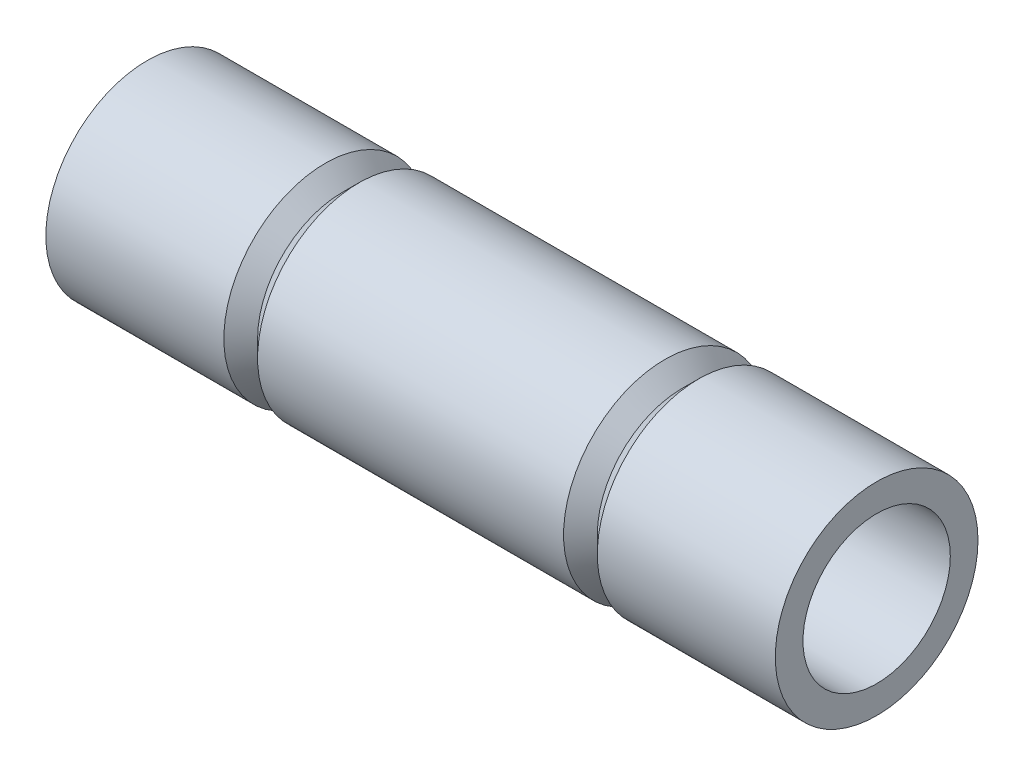
ISO-10303-21;
HEADER;
FILE_DESCRIPTION(('STEP AP214'),'2;1');
FILE_NAME('part.step','',(''),(''),'','','');
FILE_SCHEMA(('AUTOMOTIVE_DESIGN { 1 0 10303 214 1 1 1 1 }'));
ENDSEC;
DATA;
#1=APPLICATION_CONTEXT('core data for automotive mechanical design processes');
#2=APPLICATION_PROTOCOL_DEFINITION('international standard','automotive_design',2000,#1);
#3=PRODUCT_CONTEXT('',#1,'mechanical');
#4=PRODUCT('Part','Part','',(#3));
#5=PRODUCT_RELATED_PRODUCT_CATEGORY('part','',(#4));
#6=PRODUCT_DEFINITION_FORMATION('','',#4);
#7=PRODUCT_DEFINITION_CONTEXT('part definition',#1,'design');
#8=PRODUCT_DEFINITION('design','',#6,#7);
#9=PRODUCT_DEFINITION_SHAPE('','',#8);
#10=(LENGTH_UNIT() NAMED_UNIT(*) SI_UNIT(.MILLI.,.METRE.));
#11=(NAMED_UNIT(*) PLANE_ANGLE_UNIT() SI_UNIT($,.RADIAN.));
#12=(NAMED_UNIT(*) SI_UNIT($,.STERADIAN.) SOLID_ANGLE_UNIT());
#13=UNCERTAINTY_MEASURE_WITH_UNIT(LENGTH_MEASURE(1.E-05),#10,'distance_accuracy_value','');
#14=(GEOMETRIC_REPRESENTATION_CONTEXT(3) GLOBAL_UNCERTAINTY_ASSIGNED_CONTEXT((#13)) GLOBAL_UNIT_ASSIGNED_CONTEXT((#10,
#11,#12)) REPRESENTATION_CONTEXT('',''));
#15=CARTESIAN_POINT('',(0.,0.,0.));
#16=DIRECTION('',(0.,0.,1.));
#17=DIRECTION('',(1.,0.,0.));
#18=AXIS2_PLACEMENT_3D('',#15,#16,#17);
#19=CARTESIAN_POINT('',(-75.692,0.,15.2908));
#20=DIRECTION('',(1.,0.,0.));
#21=DIRECTION('',(0.,0.,-1.));
#22=AXIS2_PLACEMENT_3D('',#19,#20,#21);
#23=PLANE('',#22);
#24=CARTESIAN_POINT('',(-75.692,0.,0.));
#25=DIRECTION('',(1.,0.,0.));
#26=DIRECTION('',(0.,0.,-1.));
#27=AXIS2_PLACEMENT_3D('',#24,#25,#26);
#28=CIRCLE('',#27,21.034375);
#29=CARTESIAN_POINT('',(-75.692,0.,-21.034375));
#30=VERTEX_POINT('',#29);
#31=EDGE_CURVE('E68',#30,#30,#28,.T.);
#32=ORIENTED_EDGE('',*,*,#31,.F.);
#33=EDGE_LOOP('',(#32));
#34=FACE_BOUND('',#33,.T.);
#35=CARTESIAN_POINT('',(-75.692,0.,0.));
#36=DIRECTION('',(1.,0.,0.));
#37=DIRECTION('',(0.,0.,-1.));
#38=AXIS2_PLACEMENT_3D('',#35,#36,#37);
#39=CIRCLE('',#38,15.2908);
#40=CARTESIAN_POINT('',(-75.692,0.,-15.2908));
#41=VERTEX_POINT('',#40);
#42=EDGE_CURVE('E10',#41,#41,#39,.T.);
#43=ORIENTED_EDGE('',*,*,#42,.T.);
#44=EDGE_LOOP('',(#43));
#45=FACE_BOUND('',#44,.T.);
#46=ADVANCED_FACE('F34',(#34,#45),#23,.F.);
#47=CARTESIAN_POINT('',(0.,0.,0.));
#48=DIRECTION('',(1.,0.,0.));
#49=DIRECTION('',(0.,0.,-1.));
#50=AXIS2_PLACEMENT_3D('',#47,#48,#49);
#51=CYLINDRICAL_SURFACE('',#50,15.2908);
#52=ORIENTED_EDGE('',*,*,#42,.F.);
#53=EDGE_LOOP('',(#52));
#54=FACE_BOUND('',#53,.T.);
#55=CARTESIAN_POINT('',(75.692,0.,0.));
#56=DIRECTION('',(1.,0.,0.));
#57=DIRECTION('',(0.,0.,-1.));
#58=AXIS2_PLACEMENT_3D('',#55,#56,#57);
#59=CIRCLE('',#58,15.2908);
#60=CARTESIAN_POINT('',(75.692,0.,-15.2908));
#61=VERTEX_POINT('',#60);
#62=EDGE_CURVE('E40',#61,#61,#59,.T.);
#63=ORIENTED_EDGE('',*,*,#62,.T.);
#64=EDGE_LOOP('',(#63));
#65=FACE_BOUND('',#64,.T.);
#66=ADVANCED_FACE('F75',(#54,#65),#51,.F.);
#67=CARTESIAN_POINT('',(75.692,0.,15.2908));
#68=DIRECTION('',(-1.,0.,0.));
#69=DIRECTION('',(0.,0.,1.));
#70=AXIS2_PLACEMENT_3D('',#67,#68,#69);
#71=PLANE('',#70);
#72=ORIENTED_EDGE('',*,*,#62,.F.);
#73=EDGE_LOOP('',(#72));
#74=FACE_BOUND('',#73,.T.);
#75=CARTESIAN_POINT('',(75.692,0.,0.));
#76=DIRECTION('',(1.,0.,0.));
#77=DIRECTION('',(0.,0.,-1.));
#78=AXIS2_PLACEMENT_3D('',#75,#76,#77);
#79=CIRCLE('',#78,21.034375);
#80=CARTESIAN_POINT('',(75.692,0.,-21.034375));
#81=VERTEX_POINT('',#80);
#82=EDGE_CURVE('E44',#81,#81,#79,.T.);
#83=ORIENTED_EDGE('',*,*,#82,.T.);
#84=EDGE_LOOP('',(#83));
#85=FACE_BOUND('',#84,.T.);
#86=ADVANCED_FACE('F79',(#74,#85),#71,.F.);
#87=CARTESIAN_POINT('',(0.,0.,0.));
#88=DIRECTION('',(1.,0.,0.));
#89=DIRECTION('',(0.,0.,-1.));
#90=AXIS2_PLACEMENT_3D('',#87,#88,#89);
#91=CYLINDRICAL_SURFACE('',#90,21.034375);
#92=ORIENTED_EDGE('',*,*,#82,.F.);
#93=EDGE_LOOP('',(#92));
#94=FACE_BOUND('',#93,.T.);
#95=CARTESIAN_POINT('',(38.75,0.,0.));
#96=DIRECTION('',(1.,0.,0.));
#97=DIRECTION('',(0.,0.,-1.));
#98=AXIS2_PLACEMENT_3D('',#95,#96,#97);
#99=CIRCLE('',#98,21.034375);
#100=CARTESIAN_POINT('',(38.75,0.,-21.034375));
#101=VERTEX_POINT('',#100);
#102=EDGE_CURVE('E48',#101,#101,#99,.T.);
#103=ORIENTED_EDGE('',*,*,#102,.T.);
#104=EDGE_LOOP('',(#103));
#105=FACE_BOUND('',#104,.T.);
#106=ADVANCED_FACE('F84',(#94,#105),#91,.T.);
#107=CARTESIAN_POINT('',(35.25,0.,0.));
#108=DIRECTION('',(1.,0.,0.));
#109=DIRECTION('',(0.,0.,-1.));
#110=AXIS2_PLACEMENT_3D('',#107,#108,#109);
#111=CONICAL_SURFACE('',#110,17.534375,0.785398163397447);
#112=ORIENTED_EDGE('',*,*,#102,.F.);
#113=EDGE_LOOP('',(#112));
#114=FACE_BOUND('',#113,.T.);
#115=CARTESIAN_POINT('',(35.25,0.,0.));
#116=DIRECTION('',(1.,0.,0.));
#117=DIRECTION('',(0.,0.,-1.));
#118=AXIS2_PLACEMENT_3D('',#115,#116,#117);
#119=CIRCLE('',#118,17.534375);
#120=CARTESIAN_POINT('',(35.25,0.,-17.534375));
#121=VERTEX_POINT('',#120);
#122=EDGE_CURVE('E53',#121,#121,#119,.T.);
#123=ORIENTED_EDGE('',*,*,#122,.T.);
#124=EDGE_LOOP('',(#123));
#125=FACE_BOUND('',#124,.T.);
#126=ADVANCED_FACE('F90',(#114,#125),#111,.T.);
#127=CARTESIAN_POINT('',(31.75,0.,0.));
#128=DIRECTION('',(-1.,0.,0.));
#129=DIRECTION('',(0.,0.,1.));
#130=AXIS2_PLACEMENT_3D('',#127,#128,#129);
#131=CONICAL_SURFACE('',#130,21.034375,0.785398163397448);
#132=ORIENTED_EDGE('',*,*,#122,.F.);
#133=EDGE_LOOP('',(#132));
#134=FACE_BOUND('',#133,.T.);
#135=CARTESIAN_POINT('',(31.75,0.,0.));
#136=DIRECTION('',(1.,0.,0.));
#137=DIRECTION('',(0.,0.,-1.));
#138=AXIS2_PLACEMENT_3D('',#135,#136,#137);
#139=CIRCLE('',#138,21.034375);
#140=CARTESIAN_POINT('',(31.75,0.,-21.034375));
#141=VERTEX_POINT('',#140);
#142=EDGE_CURVE('E56',#141,#141,#139,.T.);
#143=ORIENTED_EDGE('',*,*,#142,.T.);
#144=EDGE_LOOP('',(#143));
#145=FACE_BOUND('',#144,.T.);
#146=ADVANCED_FACE('F94',(#134,#145),#131,.T.);
#147=CARTESIAN_POINT('',(0.,0.,0.));
#148=DIRECTION('',(1.,0.,0.));
#149=DIRECTION('',(0.,0.,-1.));
#150=AXIS2_PLACEMENT_3D('',#147,#148,#149);
#151=CYLINDRICAL_SURFACE('',#150,21.034375);
#152=ORIENTED_EDGE('',*,*,#142,.F.);
#153=EDGE_LOOP('',(#152));
#154=FACE_BOUND('',#153,.T.);
#155=CARTESIAN_POINT('',(-31.75,0.,0.));
#156=DIRECTION('',(1.,0.,0.));
#157=DIRECTION('',(0.,0.,-1.));
#158=AXIS2_PLACEMENT_3D('',#155,#156,#157);
#159=CIRCLE('',#158,21.034375);
#160=CARTESIAN_POINT('',(-31.75,0.,-21.034375));
#161=VERTEX_POINT('',#160);
#162=EDGE_CURVE('E59',#161,#161,#159,.T.);
#163=ORIENTED_EDGE('',*,*,#162,.T.);
#164=EDGE_LOOP('',(#163));
#165=FACE_BOUND('',#164,.T.);
#166=ADVANCED_FACE('F98',(#154,#165),#151,.T.);
#167=CARTESIAN_POINT('',(-35.25,0.,0.));
#168=DIRECTION('',(1.,0.,0.));
#169=DIRECTION('',(0.,0.,-1.));
#170=AXIS2_PLACEMENT_3D('',#167,#168,#169);
#171=CONICAL_SURFACE('',#170,17.534375,0.785398163397448);
#172=ORIENTED_EDGE('',*,*,#162,.F.);
#173=EDGE_LOOP('',(#172));
#174=FACE_BOUND('',#173,.T.);
#175=CARTESIAN_POINT('',(-35.25,0.,0.));
#176=DIRECTION('',(1.,0.,0.));
#177=DIRECTION('',(0.,0.,-1.));
#178=AXIS2_PLACEMENT_3D('',#175,#176,#177);
#179=CIRCLE('',#178,17.534375);
#180=CARTESIAN_POINT('',(-35.25,0.,-17.534375));
#181=VERTEX_POINT('',#180);
#182=EDGE_CURVE('E62',#181,#181,#179,.T.);
#183=ORIENTED_EDGE('',*,*,#182,.T.);
#184=EDGE_LOOP('',(#183));
#185=FACE_BOUND('',#184,.T.);
#186=ADVANCED_FACE('F102',(#174,#185),#171,.T.);
#187=CARTESIAN_POINT('',(-38.75,0.,0.));
#188=DIRECTION('',(-1.,0.,0.));
#189=DIRECTION('',(0.,0.,1.));
#190=AXIS2_PLACEMENT_3D('',#187,#188,#189);
#191=CONICAL_SURFACE('',#190,21.034375,0.785398163397449);
#192=ORIENTED_EDGE('',*,*,#182,.F.);
#193=EDGE_LOOP('',(#192));
#194=FACE_BOUND('',#193,.T.);
#195=CARTESIAN_POINT('',(-38.75,0.,0.));
#196=DIRECTION('',(1.,0.,0.));
#197=DIRECTION('',(0.,0.,-1.));
#198=AXIS2_PLACEMENT_3D('',#195,#196,#197);
#199=CIRCLE('',#198,21.034375);
#200=CARTESIAN_POINT('',(-38.75,0.,-21.034375));
#201=VERTEX_POINT('',#200);
#202=EDGE_CURVE('E65',#201,#201,#199,.T.);
#203=ORIENTED_EDGE('',*,*,#202,.T.);
#204=EDGE_LOOP('',(#203));
#205=FACE_BOUND('',#204,.T.);
#206=ADVANCED_FACE('F106',(#194,#205),#191,.T.);
#207=CARTESIAN_POINT('',(0.,0.,0.));
#208=DIRECTION('',(1.,0.,0.));
#209=DIRECTION('',(0.,0.,-1.));
#210=AXIS2_PLACEMENT_3D('',#207,#208,#209);
#211=CYLINDRICAL_SURFACE('',#210,21.034375);
#212=ORIENTED_EDGE('',*,*,#202,.F.);
#213=EDGE_LOOP('',(#212));
#214=FACE_BOUND('',#213,.T.);
#215=ORIENTED_EDGE('',*,*,#31,.T.);
#216=EDGE_LOOP('',(#215));
#217=FACE_BOUND('',#216,.T.);
#218=ADVANCED_FACE('F72',(#214,#217),#211,.T.);
#219=CLOSED_SHELL('',(#46,#66,#86,#106,#126,#146,#166,#186,#206,#218));
#220=MANIFOLD_SOLID_BREP('B2',#219);
#221=ADVANCED_BREP_SHAPE_REPRESENTATION('',(#18,#220),#14);
#222=SHAPE_DEFINITION_REPRESENTATION(#9,#221);
ENDSEC;
END-ISO-10303-21;
